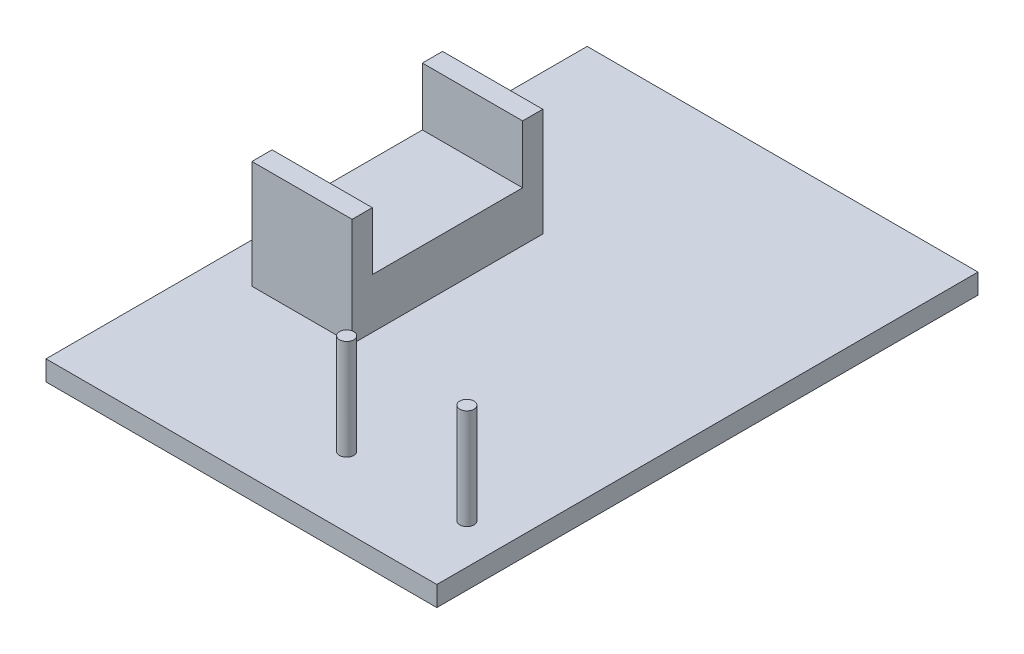
ISO-10303-21;
HEADER;
FILE_DESCRIPTION(('STEP AP214'),'2;1');
FILE_NAME('part.step','',(''),(''),'','','');
FILE_SCHEMA(('AUTOMOTIVE_DESIGN { 1 0 10303 214 1 1 1 1 }'));
ENDSEC;
DATA;
#1=APPLICATION_CONTEXT('core data for automotive mechanical design processes');
#2=APPLICATION_PROTOCOL_DEFINITION('international standard','automotive_design',2000,#1);
#3=PRODUCT_CONTEXT('',#1,'mechanical');
#4=PRODUCT('Part','Part','',(#3));
#5=PRODUCT_RELATED_PRODUCT_CATEGORY('part','',(#4));
#6=PRODUCT_DEFINITION_FORMATION('','',#4);
#7=PRODUCT_DEFINITION_CONTEXT('part definition',#1,'design');
#8=PRODUCT_DEFINITION('design','',#6,#7);
#9=PRODUCT_DEFINITION_SHAPE('','',#8);
#10=(LENGTH_UNIT() NAMED_UNIT(*) SI_UNIT(.MILLI.,.METRE.));
#11=(NAMED_UNIT(*) PLANE_ANGLE_UNIT() SI_UNIT($,.RADIAN.));
#12=(NAMED_UNIT(*) SI_UNIT($,.STERADIAN.) SOLID_ANGLE_UNIT());
#13=UNCERTAINTY_MEASURE_WITH_UNIT(LENGTH_MEASURE(1.E-05),#10,'distance_accuracy_value','');
#14=(GEOMETRIC_REPRESENTATION_CONTEXT(3) GLOBAL_UNCERTAINTY_ASSIGNED_CONTEXT((#13)) GLOBAL_UNIT_ASSIGNED_CONTEXT((#10,
#11,#12)) REPRESENTATION_CONTEXT('',''));
#15=CARTESIAN_POINT('',(0.,0.,0.));
#16=DIRECTION('',(0.,0.,1.));
#17=DIRECTION('',(1.,0.,0.));
#18=AXIS2_PLACEMENT_3D('',#15,#16,#17);
#19=CARTESIAN_POINT('',(24.765,2.54,34.29));
#20=DIRECTION('',(-1.,0.,0.));
#21=DIRECTION('',(0.,0.,1.));
#22=AXIS2_PLACEMENT_3D('',#19,#20,#21);
#23=PLANE('',#22);
#24=DIRECTION('',(0.,0.,-1.));
#25=VECTOR('',#24,1.);
#26=CARTESIAN_POINT('',(24.765,0.,34.29));
#27=LINE('',#26,#25);
#28=CARTESIAN_POINT('',(24.765,0.,34.29));
#29=VERTEX_POINT('',#28);
#30=CARTESIAN_POINT('',(24.765,0.,-34.29));
#31=VERTEX_POINT('',#30);
#32=EDGE_CURVE('E200',#29,#31,#27,.T.);
#33=ORIENTED_EDGE('',*,*,#32,.T.);
#34=DIRECTION('',(0.,-1.,0.));
#35=VECTOR('',#34,1.);
#36=CARTESIAN_POINT('',(24.765,2.54,-34.29));
#37=LINE('',#36,#35);
#38=CARTESIAN_POINT('',(24.765,2.54,-34.29));
#39=VERTEX_POINT('',#38);
#40=EDGE_CURVE('E229',#39,#31,#37,.T.);
#41=ORIENTED_EDGE('',*,*,#40,.F.);
#42=DIRECTION('',(0.,0.,-1.));
#43=VECTOR('',#42,1.);
#44=CARTESIAN_POINT('',(24.765,2.54,34.29));
#45=LINE('',#44,#43);
#46=CARTESIAN_POINT('',(24.765,2.54,34.29));
#47=VERTEX_POINT('',#46);
#48=EDGE_CURVE('E203',#47,#39,#45,.T.);
#49=ORIENTED_EDGE('',*,*,#48,.F.);
#50=DIRECTION('',(0.,-1.,0.));
#51=VECTOR('',#50,1.);
#52=CARTESIAN_POINT('',(24.765,2.54,34.29));
#53=LINE('',#52,#51);
#54=EDGE_CURVE('E213',#47,#29,#53,.T.);
#55=ORIENTED_EDGE('',*,*,#54,.T.);
#56=EDGE_LOOP('',(#33,#41,#49,#55));
#57=FACE_BOUND('',#56,.T.);
#58=ADVANCED_FACE('F39',(#57),#23,.F.);
#59=CARTESIAN_POINT('',(-24.765,2.54,-34.29));
#60=DIRECTION('',(0.,0.,1.));
#61=DIRECTION('',(1.,0.,0.));
#62=AXIS2_PLACEMENT_3D('',#59,#60,#61);
#63=PLANE('',#62);
#64=DIRECTION('',(-1.,0.,0.));
#65=VECTOR('',#64,1.);
#66=CARTESIAN_POINT('',(-24.765,0.,-34.29));
#67=LINE('',#66,#65);
#68=CARTESIAN_POINT('',(-24.765,0.,-34.29));
#69=VERTEX_POINT('',#68);
#70=EDGE_CURVE('E216',#31,#69,#67,.T.);
#71=ORIENTED_EDGE('',*,*,#70,.T.);
#72=DIRECTION('',(0.,-1.,0.));
#73=VECTOR('',#72,1.);
#74=CARTESIAN_POINT('',(-24.765,2.54,-34.29));
#75=LINE('',#74,#73);
#76=CARTESIAN_POINT('',(-24.765,2.54,-34.29));
#77=VERTEX_POINT('',#76);
#78=EDGE_CURVE('E226',#77,#69,#75,.T.);
#79=ORIENTED_EDGE('',*,*,#78,.F.);
#80=DIRECTION('',(-1.,0.,0.));
#81=VECTOR('',#80,1.);
#82=CARTESIAN_POINT('',(-24.765,2.54,-34.29));
#83=LINE('',#82,#81);
#84=EDGE_CURVE('E206',#39,#77,#83,.T.);
#85=ORIENTED_EDGE('',*,*,#84,.F.);
#86=ORIENTED_EDGE('',*,*,#40,.T.);
#87=EDGE_LOOP('',(#71,#79,#85,#86));
#88=FACE_BOUND('',#87,.T.);
#89=ADVANCED_FACE('F250',(#88),#63,.F.);
#90=CARTESIAN_POINT('',(-24.765,2.54,34.29));
#91=DIRECTION('',(1.,0.,0.));
#92=DIRECTION('',(0.,0.,-1.));
#93=AXIS2_PLACEMENT_3D('',#90,#91,#92);
#94=PLANE('',#93);
#95=DIRECTION('',(0.,0.,1.));
#96=VECTOR('',#95,1.);
#97=CARTESIAN_POINT('',(-24.765,0.,34.29));
#98=LINE('',#97,#96);
#99=CARTESIAN_POINT('',(-24.765,0.,34.29));
#100=VERTEX_POINT('',#99);
#101=EDGE_CURVE('E218',#69,#100,#98,.T.);
#102=ORIENTED_EDGE('',*,*,#101,.T.);
#103=DIRECTION('',(0.,-1.,0.));
#104=VECTOR('',#103,1.);
#105=CARTESIAN_POINT('',(-24.765,2.54,34.29));
#106=LINE('',#105,#104);
#107=CARTESIAN_POINT('',(-24.765,2.54,34.29));
#108=VERTEX_POINT('',#107);
#109=EDGE_CURVE('E223',#108,#100,#106,.T.);
#110=ORIENTED_EDGE('',*,*,#109,.F.);
#111=DIRECTION('',(0.,0.,1.));
#112=VECTOR('',#111,1.);
#113=CARTESIAN_POINT('',(-24.765,2.54,34.29));
#114=LINE('',#113,#112);
#115=EDGE_CURVE('E209',#77,#108,#114,.T.);
#116=ORIENTED_EDGE('',*,*,#115,.F.);
#117=ORIENTED_EDGE('',*,*,#78,.T.);
#118=EDGE_LOOP('',(#102,#110,#116,#117));
#119=FACE_BOUND('',#118,.T.);
#120=ADVANCED_FACE('F255',(#119),#94,.F.);
#121=CARTESIAN_POINT('',(-24.765,2.54,34.29));
#122=DIRECTION('',(0.,0.,-1.));
#123=DIRECTION('',(-1.,0.,0.));
#124=AXIS2_PLACEMENT_3D('',#121,#122,#123);
#125=PLANE('',#124);
#126=DIRECTION('',(1.,0.,0.));
#127=VECTOR('',#126,1.);
#128=CARTESIAN_POINT('',(-24.765,0.,34.29));
#129=LINE('',#128,#127);
#130=EDGE_CURVE('E207',#100,#29,#129,.T.);
#131=ORIENTED_EDGE('',*,*,#130,.T.);
#132=ORIENTED_EDGE('',*,*,#54,.F.);
#133=DIRECTION('',(1.,0.,0.));
#134=VECTOR('',#133,1.);
#135=CARTESIAN_POINT('',(-24.765,2.54,34.29));
#136=LINE('',#135,#134);
#137=EDGE_CURVE('E211',#108,#47,#136,.T.);
#138=ORIENTED_EDGE('',*,*,#137,.F.);
#139=ORIENTED_EDGE('',*,*,#109,.T.);
#140=EDGE_LOOP('',(#131,#132,#138,#139));
#141=FACE_BOUND('',#140,.T.);
#142=ADVANCED_FACE('F240',(#141),#125,.F.);
#143=CARTESIAN_POINT('',(0.,2.54,0.));
#144=DIRECTION('',(0.,-1.,0.));
#145=DIRECTION('',(0.,0.,-1.));
#146=AXIS2_PLACEMENT_3D('',#143,#144,#145);
#147=PLANE('',#146);
#148=DIRECTION('',(-1.,0.,0.));
#149=VECTOR('',#148,1.);
#150=CARTESIAN_POINT('',(-6.985,2.54,-10.8829603782326));
#151=LINE('',#150,#149);
#152=CARTESIAN_POINT('',(-6.985,2.54,-10.8829603782326));
#153=VERTEX_POINT('',#152);
#154=CARTESIAN_POINT('',(-19.685,2.54,-10.8829603782326));
#155=VERTEX_POINT('',#154);
#156=EDGE_CURVE('E53',#153,#155,#151,.T.);
#157=ORIENTED_EDGE('',*,*,#156,.F.);
#158=DIRECTION('',(0.,0.,1.));
#159=VECTOR('',#158,1.);
#160=CARTESIAN_POINT('',(-6.985,2.54,13.2773478992192));
#161=LINE('',#160,#159);
#162=CARTESIAN_POINT('',(-6.985,2.54,13.2773478992192));
#163=VERTEX_POINT('',#162);
#164=EDGE_CURVE('E57',#153,#163,#161,.T.);
#165=ORIENTED_EDGE('',*,*,#164,.T.);
#166=DIRECTION('',(-1.,0.,0.));
#167=VECTOR('',#166,1.);
#168=CARTESIAN_POINT('',(-6.985,2.54,13.2773478992192));
#169=LINE('',#168,#167);
#170=CARTESIAN_POINT('',(-19.685,2.54,13.2773478992192));
#171=VERTEX_POINT('',#170);
#172=EDGE_CURVE('E136',#163,#171,#169,.T.);
#173=ORIENTED_EDGE('',*,*,#172,.T.);
#174=DIRECTION('',(0.,0.,1.));
#175=VECTOR('',#174,1.);
#176=CARTESIAN_POINT('',(-19.685,2.54,13.2773478992192));
#177=LINE('',#176,#175);
#178=EDGE_CURVE('E165',#155,#171,#177,.T.);
#179=ORIENTED_EDGE('',*,*,#178,.F.);
#180=EDGE_LOOP('',(#157,#165,#173,#179));
#181=FACE_BOUND('',#180,.T.);
#182=CARTESIAN_POINT('',(4.445,2.54,25.4));
#183=DIRECTION('',(0.,-1.,0.));
#184=DIRECTION('',(0.,0.,-1.));
#185=AXIS2_PLACEMENT_3D('',#182,#183,#184);
#186=CIRCLE('',#185,0.9);
#187=CARTESIAN_POINT('',(4.445,2.54,24.5));
#188=VERTEX_POINT('',#187);
#189=EDGE_CURVE('E11',#188,#188,#186,.F.);
#190=ORIENTED_EDGE('',*,*,#189,.F.);
#191=EDGE_LOOP('',(#190));
#192=FACE_BOUND('',#191,.T.);
#193=CARTESIAN_POINT('',(19.685,2.54,25.4));
#194=DIRECTION('',(0.,-1.,0.));
#195=DIRECTION('',(0.,0.,-1.));
#196=AXIS2_PLACEMENT_3D('',#193,#194,#195);
#197=CIRCLE('',#196,0.900000000000001);
#198=CARTESIAN_POINT('',(19.685,2.54,24.5));
#199=VERTEX_POINT('',#198);
#200=EDGE_CURVE('E46',#199,#199,#197,.F.);
#201=ORIENTED_EDGE('',*,*,#200,.F.);
#202=EDGE_LOOP('',(#201));
#203=FACE_BOUND('',#202,.T.);
#204=ORIENTED_EDGE('',*,*,#48,.T.);
#205=ORIENTED_EDGE('',*,*,#84,.T.);
#206=ORIENTED_EDGE('',*,*,#115,.T.);
#207=ORIENTED_EDGE('',*,*,#137,.T.);
#208=EDGE_LOOP('',(#204,#205,#206,#207));
#209=FACE_BOUND('',#208,.T.);
#210=ADVANCED_FACE('F236',(#181,#192,#203,#209),#147,.F.);
#211=CARTESIAN_POINT('',(0.,0.,0.));
#212=DIRECTION('',(0.,-1.,0.));
#213=DIRECTION('',(0.,0.,-1.));
#214=AXIS2_PLACEMENT_3D('',#211,#212,#213);
#215=PLANE('',#214);
#216=ORIENTED_EDGE('',*,*,#32,.F.);
#217=ORIENTED_EDGE('',*,*,#130,.F.);
#218=ORIENTED_EDGE('',*,*,#101,.F.);
#219=ORIENTED_EDGE('',*,*,#70,.F.);
#220=EDGE_LOOP('',(#216,#217,#218,#219));
#221=FACE_BOUND('',#220,.T.);
#222=ADVANCED_FACE('F239',(#221),#215,.T.);
#223=CARTESIAN_POINT('',(19.685,15.24,25.4));
#224=DIRECTION('',(0.,-1.,0.));
#225=DIRECTION('',(0.,0.,-1.));
#226=AXIS2_PLACEMENT_3D('',#223,#224,#225);
#227=CYLINDRICAL_SURFACE('',#226,0.900000000000001);
#228=CARTESIAN_POINT('',(19.685,15.24,25.4));
#229=DIRECTION('',(0.,1.,0.));
#230=DIRECTION('',(0.,0.,1.));
#231=AXIS2_PLACEMENT_3D('',#228,#229,#230);
#232=CIRCLE('',#231,0.900000000000001);
#233=CARTESIAN_POINT('',(19.685,15.24,26.3));
#234=VERTEX_POINT('',#233);
#235=EDGE_CURVE('E186',#234,#234,#232,.T.);
#236=ORIENTED_EDGE('',*,*,#235,.F.);
#237=EDGE_LOOP('',(#236));
#238=FACE_BOUND('',#237,.T.);
#239=ORIENTED_EDGE('',*,*,#200,.T.);
#240=EDGE_LOOP('',(#239));
#241=FACE_BOUND('',#240,.T.);
#242=ADVANCED_FACE('F234',(#238,#241),#227,.T.);
#243=CARTESIAN_POINT('',(19.685,15.24,25.4));
#244=DIRECTION('',(0.,1.,0.));
#245=DIRECTION('',(0.,0.,1.));
#246=AXIS2_PLACEMENT_3D('',#243,#244,#245);
#247=PLANE('',#246);
#248=ORIENTED_EDGE('',*,*,#235,.T.);
#249=EDGE_LOOP('',(#248));
#250=FACE_BOUND('',#249,.T.);
#251=ADVANCED_FACE('F265',(#250),#247,.T.);
#252=CARTESIAN_POINT('',(4.445,15.24,25.4));
#253=DIRECTION('',(0.,-1.,0.));
#254=DIRECTION('',(0.,0.,-1.));
#255=AXIS2_PLACEMENT_3D('',#252,#253,#254);
#256=CYLINDRICAL_SURFACE('',#255,0.9);
#257=CARTESIAN_POINT('',(4.445,15.24,25.4));
#258=DIRECTION('',(0.,1.,0.));
#259=DIRECTION('',(0.,0.,1.));
#260=AXIS2_PLACEMENT_3D('',#257,#258,#259);
#261=CIRCLE('',#260,0.9);
#262=CARTESIAN_POINT('',(4.445,15.24,26.3));
#263=VERTEX_POINT('',#262);
#264=EDGE_CURVE('E197',#263,#263,#261,.T.);
#265=ORIENTED_EDGE('',*,*,#264,.F.);
#266=EDGE_LOOP('',(#265));
#267=FACE_BOUND('',#266,.T.);
#268=ORIENTED_EDGE('',*,*,#189,.T.);
#269=EDGE_LOOP('',(#268));
#270=FACE_BOUND('',#269,.T.);
#271=ADVANCED_FACE('F316',(#267,#270),#256,.T.);
#272=CARTESIAN_POINT('',(4.445,15.24,25.4));
#273=DIRECTION('',(0.,1.,0.));
#274=DIRECTION('',(0.,0.,1.));
#275=AXIS2_PLACEMENT_3D('',#272,#273,#274);
#276=PLANE('',#275);
#277=ORIENTED_EDGE('',*,*,#264,.T.);
#278=EDGE_LOOP('',(#277));
#279=FACE_BOUND('',#278,.T.);
#280=ADVANCED_FACE('F325',(#279),#276,.T.);
#281=CARTESIAN_POINT('',(-6.985,2.54,-10.8829603782326));
#282=DIRECTION('',(0.,0.,-1.));
#283=DIRECTION('',(-1.,0.,0.));
#284=AXIS2_PLACEMENT_3D('',#281,#282,#283);
#285=PLANE('',#284);
#286=DIRECTION('',(0.,-1.,0.));
#287=VECTOR('',#286,1.);
#288=CARTESIAN_POINT('',(-19.685,2.54,-10.8829603782326));
#289=LINE('',#288,#287);
#290=CARTESIAN_POINT('',(-19.685,16.2343055861811,-10.8829603782326));
#291=VERTEX_POINT('',#290);
#292=EDGE_CURVE('E149',#291,#155,#289,.T.);
#293=ORIENTED_EDGE('',*,*,#292,.F.);
#294=DIRECTION('',(-1.,0.,0.));
#295=VECTOR('',#294,1.);
#296=CARTESIAN_POINT('',(-6.985,16.2343055861811,-10.8829603782326));
#297=LINE('',#296,#295);
#298=CARTESIAN_POINT('',(-6.985,16.2343055861811,-10.8829603782326));
#299=VERTEX_POINT('',#298);
#300=EDGE_CURVE('E187',#299,#291,#297,.T.);
#301=ORIENTED_EDGE('',*,*,#300,.F.);
#302=DIRECTION('',(0.,-1.,0.));
#303=VECTOR('',#302,1.);
#304=CARTESIAN_POINT('',(-6.985,2.54,-10.8829603782326));
#305=LINE('',#304,#303);
#306=EDGE_CURVE('E162',#299,#153,#305,.T.);
#307=ORIENTED_EDGE('',*,*,#306,.T.);
#308=ORIENTED_EDGE('',*,*,#156,.T.);
#309=EDGE_LOOP('',(#293,#301,#307,#308));
#310=FACE_BOUND('',#309,.T.);
#311=ADVANCED_FACE('F334',(#310),#285,.T.);
#312=CARTESIAN_POINT('',(-6.985,16.2343055861811,-10.8829603782326));
#313=DIRECTION('',(0.,1.,0.));
#314=DIRECTION('',(0.,0.,1.));
#315=AXIS2_PLACEMENT_3D('',#312,#313,#314);
#316=PLANE('',#315);
#317=DIRECTION('',(0.,0.,-1.));
#318=VECTOR('',#317,1.);
#319=CARTESIAN_POINT('',(-19.685,16.2343055861811,-10.8829603782326));
#320=LINE('',#319,#318);
#321=CARTESIAN_POINT('',(-19.685,16.2343055861811,-8.32780623950669));
#322=VERTEX_POINT('',#321);
#323=EDGE_CURVE('E180',#322,#291,#320,.T.);
#324=ORIENTED_EDGE('',*,*,#323,.F.);
#325=DIRECTION('',(-1.,0.,0.));
#326=VECTOR('',#325,1.);
#327=CARTESIAN_POINT('',(-6.985,16.2343055861811,-8.32780623950669));
#328=LINE('',#327,#326);
#329=CARTESIAN_POINT('',(-6.985,16.2343055861811,-8.32780623950669));
#330=VERTEX_POINT('',#329);
#331=EDGE_CURVE('E189',#330,#322,#328,.T.);
#332=ORIENTED_EDGE('',*,*,#331,.F.);
#333=DIRECTION('',(0.,0.,-1.));
#334=VECTOR('',#333,1.);
#335=CARTESIAN_POINT('',(-6.985,16.2343055861811,-10.8829603782326));
#336=LINE('',#335,#334);
#337=EDGE_CURVE('E159',#330,#299,#336,.T.);
#338=ORIENTED_EDGE('',*,*,#337,.T.);
#339=ORIENTED_EDGE('',*,*,#300,.T.);
#340=EDGE_LOOP('',(#324,#332,#338,#339));
#341=FACE_BOUND('',#340,.T.);
#342=ADVANCED_FACE('F343',(#341),#316,.T.);
#343=CARTESIAN_POINT('',(-6.985,16.2343055861811,-8.32780623950669));
#344=DIRECTION('',(0.,0.,1.));
#345=DIRECTION('',(1.,0.,0.));
#346=AXIS2_PLACEMENT_3D('',#343,#344,#345);
#347=PLANE('',#346);
#348=DIRECTION('',(0.,1.,0.));
#349=VECTOR('',#348,1.);
#350=CARTESIAN_POINT('',(-19.685,16.2343055861811,-8.32780623950669));
#351=LINE('',#350,#349);
#352=CARTESIAN_POINT('',(-19.685,8.89,-8.32780623950669));
#353=VERTEX_POINT('',#352);
#354=EDGE_CURVE('E177',#353,#322,#351,.T.);
#355=ORIENTED_EDGE('',*,*,#354,.F.);
#356=DIRECTION('',(-1.,0.,0.));
#357=VECTOR('',#356,1.);
#358=CARTESIAN_POINT('',(-6.985,8.89,-8.32780623950669));
#359=LINE('',#358,#357);
#360=CARTESIAN_POINT('',(-6.985,8.89,-8.32780623950669));
#361=VERTEX_POINT('',#360);
#362=EDGE_CURVE('E191',#361,#353,#359,.T.);
#363=ORIENTED_EDGE('',*,*,#362,.F.);
#364=DIRECTION('',(0.,1.,0.));
#365=VECTOR('',#364,1.);
#366=CARTESIAN_POINT('',(-6.985,16.2343055861811,-8.32780623950669));
#367=LINE('',#366,#365);
#368=EDGE_CURVE('E156',#361,#330,#367,.T.);
#369=ORIENTED_EDGE('',*,*,#368,.T.);
#370=ORIENTED_EDGE('',*,*,#331,.T.);
#371=EDGE_LOOP('',(#355,#363,#369,#370));
#372=FACE_BOUND('',#371,.T.);
#373=ADVANCED_FACE('F352',(#372),#347,.T.);
#374=CARTESIAN_POINT('',(-6.985,8.89,-8.32780623950669));
#375=DIRECTION('',(0.,1.,0.));
#376=DIRECTION('',(0.,0.,1.));
#377=AXIS2_PLACEMENT_3D('',#374,#375,#376);
#378=PLANE('',#377);
#379=DIRECTION('',(0.,0.,-1.));
#380=VECTOR('',#379,1.);
#381=CARTESIAN_POINT('',(-19.685,8.89,-8.32780623950669));
#382=LINE('',#381,#380);
#383=CARTESIAN_POINT('',(-19.685,8.89,10.7221937604933));
#384=VERTEX_POINT('',#383);
#385=EDGE_CURVE('E174',#384,#353,#382,.T.);
#386=ORIENTED_EDGE('',*,*,#385,.F.);
#387=DIRECTION('',(-1.,0.,0.));
#388=VECTOR('',#387,1.);
#389=CARTESIAN_POINT('',(-6.985,8.89,10.7221937604933));
#390=LINE('',#389,#388);
#391=CARTESIAN_POINT('',(-6.985,8.89,10.7221937604933));
#392=VERTEX_POINT('',#391);
#393=EDGE_CURVE('E193',#392,#384,#390,.T.);
#394=ORIENTED_EDGE('',*,*,#393,.F.);
#395=DIRECTION('',(0.,0.,-1.));
#396=VECTOR('',#395,1.);
#397=CARTESIAN_POINT('',(-6.985,8.89,-8.32780623950669));
#398=LINE('',#397,#396);
#399=EDGE_CURVE('E153',#392,#361,#398,.T.);
#400=ORIENTED_EDGE('',*,*,#399,.T.);
#401=ORIENTED_EDGE('',*,*,#362,.T.);
#402=EDGE_LOOP('',(#386,#394,#400,#401));
#403=FACE_BOUND('',#402,.T.);
#404=ADVANCED_FACE('F361',(#403),#378,.T.);
#405=CARTESIAN_POINT('',(-6.985,8.89,10.7221937604933));
#406=DIRECTION('',(0.,0.,-1.));
#407=DIRECTION('',(-1.,0.,0.));
#408=AXIS2_PLACEMENT_3D('',#405,#406,#407);
#409=PLANE('',#408);
#410=DIRECTION('',(0.,-1.,0.));
#411=VECTOR('',#410,1.);
#412=CARTESIAN_POINT('',(-19.685,8.89,10.7221937604933));
#413=LINE('',#412,#411);
#414=CARTESIAN_POINT('',(-19.685,16.2343055861811,10.7221937604933));
#415=VERTEX_POINT('',#414);
#416=EDGE_CURVE('E171',#415,#384,#413,.T.);
#417=ORIENTED_EDGE('',*,*,#416,.F.);
#418=DIRECTION('',(-1.,0.,0.));
#419=VECTOR('',#418,1.);
#420=CARTESIAN_POINT('',(-6.985,16.2343055861811,10.7221937604933));
#421=LINE('',#420,#419);
#422=CARTESIAN_POINT('',(-6.985,16.2343055861811,10.7221937604933));
#423=VERTEX_POINT('',#422);
#424=EDGE_CURVE('E135',#423,#415,#421,.T.);
#425=ORIENTED_EDGE('',*,*,#424,.F.);
#426=DIRECTION('',(0.,-1.,0.));
#427=VECTOR('',#426,1.);
#428=CARTESIAN_POINT('',(-6.985,8.89,10.7221937604933));
#429=LINE('',#428,#427);
#430=EDGE_CURVE('E145',#423,#392,#429,.T.);
#431=ORIENTED_EDGE('',*,*,#430,.T.);
#432=ORIENTED_EDGE('',*,*,#393,.T.);
#433=EDGE_LOOP('',(#417,#425,#431,#432));
#434=FACE_BOUND('',#433,.T.);
#435=ADVANCED_FACE('F370',(#434),#409,.T.);
#436=CARTESIAN_POINT('',(-6.985,16.2343055861811,10.7221937604933));
#437=DIRECTION('',(0.,1.,0.));
#438=DIRECTION('',(0.,0.,1.));
#439=AXIS2_PLACEMENT_3D('',#436,#437,#438);
#440=PLANE('',#439);
#441=DIRECTION('',(0.,0.,-1.));
#442=VECTOR('',#441,1.);
#443=CARTESIAN_POINT('',(-19.685,16.2343055861811,10.7221937604933));
#444=LINE('',#443,#442);
#445=CARTESIAN_POINT('',(-19.685,16.2343055861811,13.2773478992192));
#446=VERTEX_POINT('',#445);
#447=EDGE_CURVE('E130',#446,#415,#444,.T.);
#448=ORIENTED_EDGE('',*,*,#447,.F.);
#449=DIRECTION('',(-1.,0.,0.));
#450=VECTOR('',#449,1.);
#451=CARTESIAN_POINT('',(-6.985,16.2343055861811,13.2773478992192));
#452=LINE('',#451,#450);
#453=CARTESIAN_POINT('',(-6.985,16.2343055861811,13.2773478992192));
#454=VERTEX_POINT('',#453);
#455=EDGE_CURVE('E125',#454,#446,#452,.T.);
#456=ORIENTED_EDGE('',*,*,#455,.F.);
#457=DIRECTION('',(0.,0.,-1.));
#458=VECTOR('',#457,1.);
#459=CARTESIAN_POINT('',(-6.985,16.2343055861811,10.7221937604933));
#460=LINE('',#459,#458);
#461=EDGE_CURVE('E128',#454,#423,#460,.T.);
#462=ORIENTED_EDGE('',*,*,#461,.T.);
#463=ORIENTED_EDGE('',*,*,#424,.T.);
#464=EDGE_LOOP('',(#448,#456,#462,#463));
#465=FACE_BOUND('',#464,.T.);
#466=ADVANCED_FACE('F127',(#465),#440,.T.);
#467=CARTESIAN_POINT('',(-6.985,16.2343055861811,13.2773478992192));
#468=DIRECTION('',(0.,0.,1.));
#469=DIRECTION('',(0.,-1.,0.));
#470=AXIS2_PLACEMENT_3D('',#467,#468,#469);
#471=PLANE('',#470);
#472=DIRECTION('',(0.,1.,0.));
#473=VECTOR('',#472,1.);
#474=CARTESIAN_POINT('',(-19.685,16.2343055861811,13.2773478992192));
#475=LINE('',#474,#473);
#476=EDGE_CURVE('E168',#171,#446,#475,.T.);
#477=ORIENTED_EDGE('',*,*,#476,.F.);
#478=ORIENTED_EDGE('',*,*,#172,.F.);
#479=DIRECTION('',(0.,1.,0.));
#480=VECTOR('',#479,1.);
#481=CARTESIAN_POINT('',(-6.985,16.2343055861811,13.2773478992192));
#482=LINE('',#481,#480);
#483=EDGE_CURVE('E142',#163,#454,#482,.T.);
#484=ORIENTED_EDGE('',*,*,#483,.T.);
#485=ORIENTED_EDGE('',*,*,#455,.T.);
#486=EDGE_LOOP('',(#477,#478,#484,#485));
#487=FACE_BOUND('',#486,.T.);
#488=ADVANCED_FACE('F147',(#487),#471,.T.);
#489=CARTESIAN_POINT('',(-6.985,0.,0.));
#490=DIRECTION('',(1.,0.,0.));
#491=DIRECTION('',(0.,0.,-1.));
#492=AXIS2_PLACEMENT_3D('',#489,#490,#491);
#493=PLANE('',#492);
#494=ORIENTED_EDGE('',*,*,#164,.F.);
#495=ORIENTED_EDGE('',*,*,#306,.F.);
#496=ORIENTED_EDGE('',*,*,#337,.F.);
#497=ORIENTED_EDGE('',*,*,#368,.F.);
#498=ORIENTED_EDGE('',*,*,#399,.F.);
#499=ORIENTED_EDGE('',*,*,#430,.F.);
#500=ORIENTED_EDGE('',*,*,#461,.F.);
#501=ORIENTED_EDGE('',*,*,#483,.F.);
#502=EDGE_LOOP('',(#494,#495,#496,#497,#498,#499,#500,#501));
#503=FACE_BOUND('',#502,.T.);
#504=ADVANCED_FACE('F141',(#503),#493,.T.);
#505=CARTESIAN_POINT('',(-19.685,0.,0.));
#506=DIRECTION('',(1.,0.,0.));
#507=DIRECTION('',(0.,0.,-1.));
#508=AXIS2_PLACEMENT_3D('',#505,#506,#507);
#509=PLANE('',#508);
#510=ORIENTED_EDGE('',*,*,#178,.T.);
#511=ORIENTED_EDGE('',*,*,#476,.T.);
#512=ORIENTED_EDGE('',*,*,#447,.T.);
#513=ORIENTED_EDGE('',*,*,#416,.T.);
#514=ORIENTED_EDGE('',*,*,#385,.T.);
#515=ORIENTED_EDGE('',*,*,#354,.T.);
#516=ORIENTED_EDGE('',*,*,#323,.T.);
#517=ORIENTED_EDGE('',*,*,#292,.T.);
#518=EDGE_LOOP('',(#510,#511,#512,#513,#514,#515,#516,#517));
#519=FACE_BOUND('',#518,.T.);
#520=ADVANCED_FACE('F401',(#519),#509,.F.);
#521=CLOSED_SHELL('',(#58,#89,#120,#142,#210,#222,#242,#251,#271,#280,#311,#342,#373,#404,#435,
#466,#488,#504,#520));
#522=MANIFOLD_SOLID_BREP('B2',#521);
#523=ADVANCED_BREP_SHAPE_REPRESENTATION('',(#18,#522),#14);
#524=SHAPE_DEFINITION_REPRESENTATION(#9,#523);
ENDSEC;
END-ISO-10303-21;
